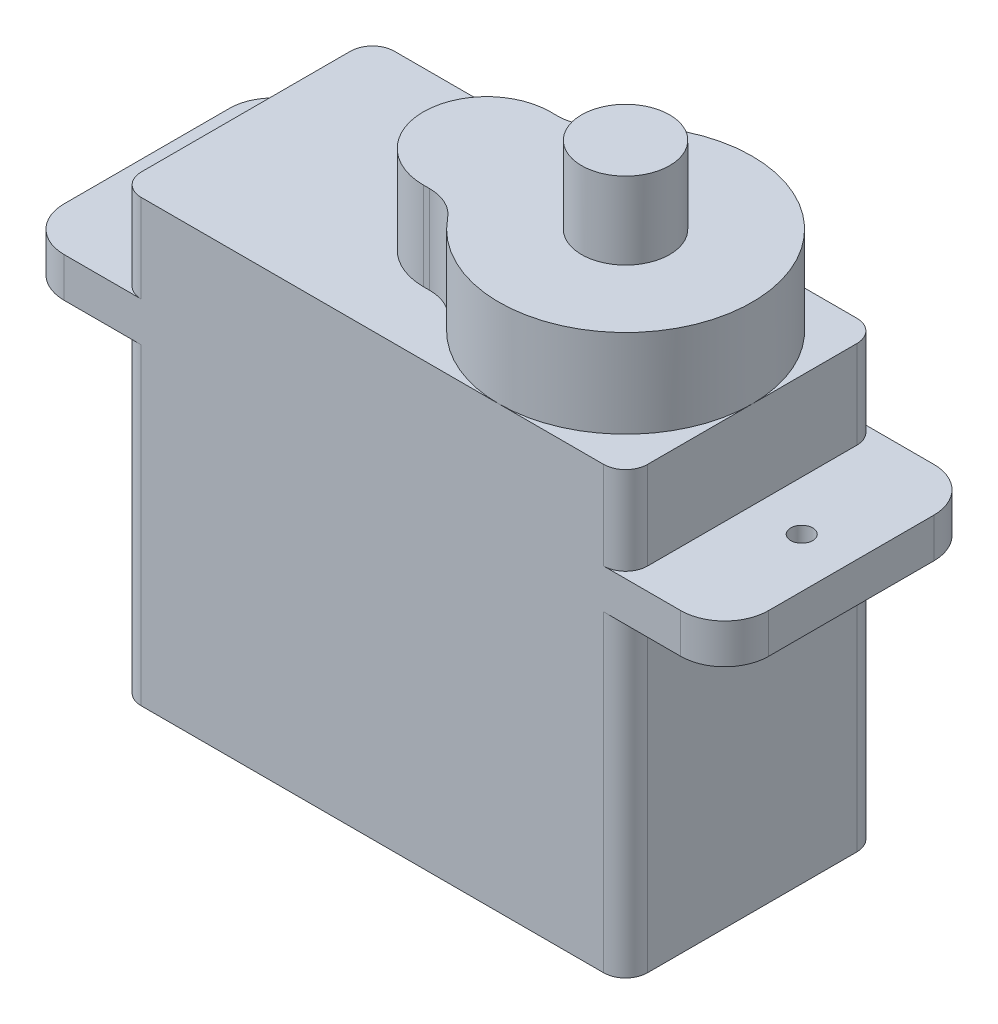
ISO-10303-21;
HEADER;
FILE_DESCRIPTION(('STEP AP214'),'2;1');
FILE_NAME('part.step','',(''),(''),'','','');
FILE_SCHEMA(('AUTOMOTIVE_DESIGN { 1 0 10303 214 1 1 1 1 }'));
ENDSEC;
DATA;
#1=APPLICATION_CONTEXT('core data for automotive mechanical design processes');
#2=APPLICATION_PROTOCOL_DEFINITION('international standard','automotive_design',2000,#1);
#3=PRODUCT_CONTEXT('',#1,'mechanical');
#4=PRODUCT('Part','Part','',(#3));
#5=PRODUCT_RELATED_PRODUCT_CATEGORY('part','',(#4));
#6=PRODUCT_DEFINITION_FORMATION('','',#4);
#7=PRODUCT_DEFINITION_CONTEXT('part definition',#1,'design');
#8=PRODUCT_DEFINITION('design','',#6,#7);
#9=PRODUCT_DEFINITION_SHAPE('','',#8);
#10=(LENGTH_UNIT() NAMED_UNIT(*) SI_UNIT(.MILLI.,.METRE.));
#11=(NAMED_UNIT(*) PLANE_ANGLE_UNIT() SI_UNIT($,.RADIAN.));
#12=(NAMED_UNIT(*) SI_UNIT($,.STERADIAN.) SOLID_ANGLE_UNIT());
#13=UNCERTAINTY_MEASURE_WITH_UNIT(LENGTH_MEASURE(1.E-05),#10,'distance_accuracy_value','');
#14=(GEOMETRIC_REPRESENTATION_CONTEXT(3) GLOBAL_UNCERTAINTY_ASSIGNED_CONTEXT((#13)) GLOBAL_UNIT_ASSIGNED_CONTEXT((#10,
#11,#12)) REPRESENTATION_CONTEXT('',''));
#15=CARTESIAN_POINT('',(0.,0.,0.));
#16=DIRECTION('',(0.,0.,1.));
#17=DIRECTION('',(1.,0.,0.));
#18=AXIS2_PLACEMENT_3D('',#15,#16,#17);
#19=CARTESIAN_POINT('',(-0.290992678358187,14.,10.6047819168344));
#20=DIRECTION('',(0.,-1.,0.));
#21=DIRECTION('',(0.,0.,-1.));
#22=AXIS2_PLACEMENT_3D('',#19,#20,#21);
#23=PLANE('',#22);
#24=CARTESIAN_POINT('',(-0.290992678358187,14.,10.6047819168344));
#25=DIRECTION('',(0.,-1.,0.));
#26=DIRECTION('',(0.,0.,-1.));
#27=AXIS2_PLACEMENT_3D('',#24,#25,#26);
#28=CIRCLE('',#27,2.);
#29=CARTESIAN_POINT('',(-0.290992678358187,14.,8.60478191683445));
#30=VERTEX_POINT('',#29);
#31=CARTESIAN_POINT('',(1.26797317412135,14.,9.35193497055459));
#32=VERTEX_POINT('',#31);
#33=EDGE_CURVE('E256',#30,#32,#28,.T.);
#34=ORIENTED_EDGE('',*,*,#33,.T.);
#35=CARTESIAN_POINT('',(5.75,14.,5.75));
#36=DIRECTION('',(0.,1.,0.));
#37=DIRECTION('',(0.,0.,1.));
#38=AXIS2_PLACEMENT_3D('',#35,#36,#37);
#39=CIRCLE('',#38,5.75);
#40=CARTESIAN_POINT('',(1.300370190019,14.,2.10811936574955));
#41=VERTEX_POINT('',#40);
#42=EDGE_CURVE('E242',#32,#41,#39,.T.);
#43=ORIENTED_EDGE('',*,*,#42,.T.);
#44=CARTESIAN_POINT('',(-0.247327135191779,14.,0.841378275575481));
#45=DIRECTION('',(0.,1.,0.));
#46=DIRECTION('',(0.,0.,1.));
#47=AXIS2_PLACEMENT_3D('',#44,#45,#46);
#48=CIRCLE('',#47,2.);
#49=CARTESIAN_POINT('',(-0.247327135191779,14.,2.84137827557548));
#50=VERTEX_POINT('',#49);
#51=EDGE_CURVE('E255',#50,#41,#48,.T.);
#52=ORIENTED_EDGE('',*,*,#51,.F.);
#53=DIRECTION('',(-1.,0.,0.));
#54=VECTOR('',#53,1.);
#55=CARTESIAN_POINT('',(-0.247327135191779,14.,2.84137827557548));
#56=LINE('',#55,#54);
#57=CARTESIAN_POINT('',(-0.577609194778006,14.,2.84137827557548));
#58=VERTEX_POINT('',#57);
#59=EDGE_CURVE('E527',#50,#58,#56,.T.);
#60=ORIENTED_EDGE('',*,*,#59,.T.);
#61=CARTESIAN_POINT('',(-0.577609194778006,14.,5.72308009620496));
#62=DIRECTION('',(0.,1.,0.));
#63=DIRECTION('',(0.,0.,1.));
#64=AXIS2_PLACEMENT_3D('',#61,#62,#63);
#65=CIRCLE('',#64,2.88170182062948);
#66=CARTESIAN_POINT('',(-0.577609194778006,14.,8.60478191683445));
#67=VERTEX_POINT('',#66);
#68=EDGE_CURVE('E525',#58,#67,#65,.T.);
#69=ORIENTED_EDGE('',*,*,#68,.T.);
#70=DIRECTION('',(-1.,0.,0.));
#71=VECTOR('',#70,1.);
#72=CARTESIAN_POINT('',(-0.290992678358187,14.,8.60478191683445));
#73=LINE('',#72,#71);
#74=EDGE_CURVE('E262',#30,#67,#73,.T.);
#75=ORIENTED_EDGE('',*,*,#74,.F.);
#76=EDGE_LOOP('',(#34,#43,#52,#60,#69,#75));
#77=FACE_BOUND('',#76,.T.);
#78=CARTESIAN_POINT('',(5.75,14.,5.75));
#79=DIRECTION('',(0.,-1.,0.));
#80=DIRECTION('',(0.,0.,-1.));
#81=AXIS2_PLACEMENT_3D('',#78,#79,#80);
#82=CIRCLE('',#81,2.);
#83=CARTESIAN_POINT('',(5.75,14.,3.75));
#84=VERTEX_POINT('',#83);
#85=EDGE_CURVE('E12',#84,#84,#82,.F.);
#86=ORIENTED_EDGE('',*,*,#85,.F.);
#87=EDGE_LOOP('',(#86));
#88=FACE_BOUND('',#87,.T.);
#89=ADVANCED_FACE('F34',(#77,#88),#23,.F.);
#90=CARTESIAN_POINT('',(16.,4.2,11.5));
#91=DIRECTION('',(0.,1.,0.));
#92=DIRECTION('',(0.,0.,1.));
#93=AXIS2_PLACEMENT_3D('',#90,#91,#92);
#94=PLANE('',#93);
#95=DIRECTION('',(0.,0.,-1.));
#96=VECTOR('',#95,1.);
#97=CARTESIAN_POINT('',(16.,4.2,11.5));
#98=LINE('',#97,#96);
#99=CARTESIAN_POINT('',(16.,4.2,9.5));
#100=VERTEX_POINT('',#99);
#101=CARTESIAN_POINT('',(16.,4.2,2.));
#102=VERTEX_POINT('',#101);
#103=EDGE_CURVE('E399',#100,#102,#98,.T.);
#104=ORIENTED_EDGE('',*,*,#103,.F.);
#105=CARTESIAN_POINT('',(14.,4.2,9.5));
#106=DIRECTION('',(0.,1.,0.));
#107=DIRECTION('',(0.,0.,1.));
#108=AXIS2_PLACEMENT_3D('',#105,#106,#107);
#109=CIRCLE('',#108,2.);
#110=CARTESIAN_POINT('',(14.,4.2,11.5));
#111=VERTEX_POINT('',#110);
#112=EDGE_CURVE('E446',#100,#111,#109,.F.);
#113=ORIENTED_EDGE('',*,*,#112,.T.);
#114=DIRECTION('',(-1.,0.,0.));
#115=VECTOR('',#114,1.);
#116=CARTESIAN_POINT('',(16.,4.2,11.5));
#117=LINE('',#116,#115);
#118=CARTESIAN_POINT('',(10.5,4.2,11.5));
#119=VERTEX_POINT('',#118);
#120=EDGE_CURVE('E414',#111,#119,#117,.T.);
#121=ORIENTED_EDGE('',*,*,#120,.T.);
#122=CARTESIAN_POINT('',(10.5,4.2,10.5));
#123=DIRECTION('',(0.,1.,0.));
#124=DIRECTION('',(0.,0.,1.));
#125=AXIS2_PLACEMENT_3D('',#122,#123,#124);
#126=CIRCLE('',#125,1.);
#127=CARTESIAN_POINT('',(11.5,4.2,10.5));
#128=VERTEX_POINT('',#127);
#129=EDGE_CURVE('E334',#119,#128,#126,.T.);
#130=ORIENTED_EDGE('',*,*,#129,.T.);
#131=DIRECTION('',(0.,0.,-1.));
#132=VECTOR('',#131,1.);
#133=CARTESIAN_POINT('',(11.5,4.2,11.5));
#134=LINE('',#133,#132);
#135=CARTESIAN_POINT('',(11.5,4.2,1.));
#136=VERTEX_POINT('',#135);
#137=EDGE_CURVE('E391',#128,#136,#134,.T.);
#138=ORIENTED_EDGE('',*,*,#137,.T.);
#139=CARTESIAN_POINT('',(10.5,4.2,1.));
#140=DIRECTION('',(0.,1.,0.));
#141=DIRECTION('',(0.,0.,1.));
#142=AXIS2_PLACEMENT_3D('',#139,#140,#141);
#143=CIRCLE('',#142,1.);
#144=CARTESIAN_POINT('',(10.5,4.2,0.));
#145=VERTEX_POINT('',#144);
#146=EDGE_CURVE('E331',#136,#145,#143,.T.);
#147=ORIENTED_EDGE('',*,*,#146,.T.);
#148=DIRECTION('',(-1.,0.,0.));
#149=VECTOR('',#148,1.);
#150=CARTESIAN_POINT('',(16.,4.2,0.));
#151=LINE('',#150,#149);
#152=CARTESIAN_POINT('',(14.,4.2,0.));
#153=VERTEX_POINT('',#152);
#154=EDGE_CURVE('E411',#153,#145,#151,.T.);
#155=ORIENTED_EDGE('',*,*,#154,.F.);
#156=CARTESIAN_POINT('',(14.,4.2,2.));
#157=DIRECTION('',(0.,1.,0.));
#158=DIRECTION('',(0.,0.,1.));
#159=AXIS2_PLACEMENT_3D('',#156,#157,#158);
#160=CIRCLE('',#159,2.);
#161=EDGE_CURVE('E415',#153,#102,#160,.F.);
#162=ORIENTED_EDGE('',*,*,#161,.T.);
#163=EDGE_LOOP('',(#104,#113,#121,#130,#138,#147,#155,#162));
#164=FACE_BOUND('',#163,.T.);
#165=CARTESIAN_POINT('',(13.75,4.2,5.75));
#166=DIRECTION('',(0.,1.,0.));
#167=DIRECTION('',(0.,0.,1.));
#168=AXIS2_PLACEMENT_3D('',#165,#166,#167);
#169=CIRCLE('',#168,0.500000000000001);
#170=CARTESIAN_POINT('',(13.75,4.2,6.25));
#171=VERTEX_POINT('',#170);
#172=EDGE_CURVE('E533',#171,#171,#169,.T.);
#173=ORIENTED_EDGE('',*,*,#172,.T.);
#174=EDGE_LOOP('',(#173));
#175=FACE_BOUND('',#174,.T.);
#176=ADVANCED_FACE('F550',(#164,#175),#94,.F.);
#177=CARTESIAN_POINT('',(16.,6.,11.5));
#178=DIRECTION('',(0.,1.,0.));
#179=DIRECTION('',(0.,0.,1.));
#180=AXIS2_PLACEMENT_3D('',#177,#178,#179);
#181=PLANE('',#180);
#182=DIRECTION('',(-1.,0.,0.));
#183=VECTOR('',#182,1.);
#184=CARTESIAN_POINT('',(16.,6.,11.5));
#185=LINE('',#184,#183);
#186=CARTESIAN_POINT('',(14.,6.,11.5));
#187=VERTEX_POINT('',#186);
#188=CARTESIAN_POINT('',(10.5,6.,11.5));
#189=VERTEX_POINT('',#188);
#190=EDGE_CURVE('E430',#187,#189,#185,.T.);
#191=ORIENTED_EDGE('',*,*,#190,.F.);
#192=CARTESIAN_POINT('',(14.,6.,9.5));
#193=DIRECTION('',(0.,1.,0.));
#194=DIRECTION('',(0.,0.,1.));
#195=AXIS2_PLACEMENT_3D('',#192,#193,#194);
#196=CIRCLE('',#195,2.);
#197=CARTESIAN_POINT('',(16.,6.,9.5));
#198=VERTEX_POINT('',#197);
#199=EDGE_CURVE('E704',#187,#198,#196,.T.);
#200=ORIENTED_EDGE('',*,*,#199,.T.);
#201=DIRECTION('',(0.,0.,-1.));
#202=VECTOR('',#201,1.);
#203=CARTESIAN_POINT('',(16.,6.,11.5));
#204=LINE('',#203,#202);
#205=CARTESIAN_POINT('',(16.,6.,2.));
#206=VERTEX_POINT('',#205);
#207=EDGE_CURVE('E408',#198,#206,#204,.T.);
#208=ORIENTED_EDGE('',*,*,#207,.T.);
#209=CARTESIAN_POINT('',(14.,6.,2.));
#210=DIRECTION('',(0.,1.,0.));
#211=DIRECTION('',(0.,0.,1.));
#212=AXIS2_PLACEMENT_3D('',#209,#210,#211);
#213=CIRCLE('',#212,2.);
#214=CARTESIAN_POINT('',(14.,6.,0.));
#215=VERTEX_POINT('',#214);
#216=EDGE_CURVE('E386',#206,#215,#213,.T.);
#217=ORIENTED_EDGE('',*,*,#216,.T.);
#218=DIRECTION('',(-1.,0.,0.));
#219=VECTOR('',#218,1.);
#220=CARTESIAN_POINT('',(16.,6.,0.));
#221=LINE('',#220,#219);
#222=CARTESIAN_POINT('',(10.5,6.,0.));
#223=VERTEX_POINT('',#222);
#224=EDGE_CURVE('E393',#215,#223,#221,.T.);
#225=ORIENTED_EDGE('',*,*,#224,.T.);
#226=CARTESIAN_POINT('',(10.5,6.,1.));
#227=DIRECTION('',(0.,1.,0.));
#228=DIRECTION('',(0.,0.,1.));
#229=AXIS2_PLACEMENT_3D('',#226,#227,#228);
#230=CIRCLE('',#229,1.);
#231=CARTESIAN_POINT('',(11.5,6.,1.));
#232=VERTEX_POINT('',#231);
#233=EDGE_CURVE('E336',#223,#232,#230,.F.);
#234=ORIENTED_EDGE('',*,*,#233,.T.);
#235=DIRECTION('',(0.,0.,-1.));
#236=VECTOR('',#235,1.);
#237=CARTESIAN_POINT('',(11.5,6.,11.5));
#238=LINE('',#237,#236);
#239=CARTESIAN_POINT('',(11.5,6.,10.5));
#240=VERTEX_POINT('',#239);
#241=EDGE_CURVE('E387',#240,#232,#238,.T.);
#242=ORIENTED_EDGE('',*,*,#241,.F.);
#243=CARTESIAN_POINT('',(10.5,6.,10.5));
#244=DIRECTION('',(0.,1.,0.));
#245=DIRECTION('',(0.,0.,1.));
#246=AXIS2_PLACEMENT_3D('',#243,#244,#245);
#247=CIRCLE('',#246,1.);
#248=EDGE_CURVE('E338',#240,#189,#247,.F.);
#249=ORIENTED_EDGE('',*,*,#248,.T.);
#250=EDGE_LOOP('',(#191,#200,#208,#217,#225,#234,#242,#249));
#251=FACE_BOUND('',#250,.T.);
#252=CARTESIAN_POINT('',(13.75,6.,5.75));
#253=DIRECTION('',(0.,-1.,0.));
#254=DIRECTION('',(0.,0.,1.));
#255=AXIS2_PLACEMENT_3D('',#252,#253,#254);
#256=CIRCLE('',#255,0.500000000000001);
#257=CARTESIAN_POINT('',(13.75,6.,6.25));
#258=VERTEX_POINT('',#257);
#259=EDGE_CURVE('E531',#258,#258,#256,.T.);
#260=ORIENTED_EDGE('',*,*,#259,.T.);
#261=EDGE_LOOP('',(#260));
#262=FACE_BOUND('',#261,.T.);
#263=ADVANCED_FACE('F555',(#251,#262),#181,.T.);
#264=CARTESIAN_POINT('',(-11.5,10.,11.5));
#265=DIRECTION('',(0.,-1.,0.));
#266=DIRECTION('',(0.,0.,-1.));
#267=AXIS2_PLACEMENT_3D('',#264,#265,#266);
#268=PLANE('',#267);
#269=DIRECTION('',(0.,0.,-1.));
#270=VECTOR('',#269,1.);
#271=CARTESIAN_POINT('',(-11.5,10.,11.5));
#272=LINE('',#271,#270);
#273=CARTESIAN_POINT('',(-11.5,10.,10.5));
#274=VERTEX_POINT('',#273);
#275=CARTESIAN_POINT('',(-11.5,10.,1.));
#276=VERTEX_POINT('',#275);
#277=EDGE_CURVE('E505',#274,#276,#272,.T.);
#278=ORIENTED_EDGE('',*,*,#277,.F.);
#279=CARTESIAN_POINT('',(-10.5,10.,10.5));
#280=DIRECTION('',(0.,-1.,0.));
#281=DIRECTION('',(0.,0.,-1.));
#282=AXIS2_PLACEMENT_3D('',#279,#280,#281);
#283=CIRCLE('',#282,1.);
#284=CARTESIAN_POINT('',(-10.5,10.,11.5));
#285=VERTEX_POINT('',#284);
#286=EDGE_CURVE('E324',#274,#285,#283,.F.);
#287=ORIENTED_EDGE('',*,*,#286,.T.);
#288=DIRECTION('',(-1.,0.,0.));
#289=VECTOR('',#288,1.);
#290=CARTESIAN_POINT('',(-11.5,10.,11.5));
#291=LINE('',#290,#289);
#292=CARTESIAN_POINT('',(5.75,10.,11.5));
#293=VERTEX_POINT('',#292);
#294=EDGE_CURVE('E499',#293,#285,#291,.T.);
#295=ORIENTED_EDGE('',*,*,#294,.F.);
#296=CARTESIAN_POINT('',(5.75,10.,5.75));
#297=DIRECTION('',(0.,1.,0.));
#298=DIRECTION('',(0.,0.,1.));
#299=AXIS2_PLACEMENT_3D('',#296,#297,#298);
#300=CIRCLE('',#299,5.75);
#301=CARTESIAN_POINT('',(1.26797317412135,10.,9.35193497055459));
#302=VERTEX_POINT('',#301);
#303=EDGE_CURVE('E371',#302,#293,#300,.T.);
#304=ORIENTED_EDGE('',*,*,#303,.F.);
#305=CARTESIAN_POINT('',(-0.290992678358187,10.,10.6047819168344));
#306=DIRECTION('',(0.,-1.,0.));
#307=DIRECTION('',(0.,0.,-1.));
#308=AXIS2_PLACEMENT_3D('',#305,#306,#307);
#309=CIRCLE('',#308,2.);
#310=CARTESIAN_POINT('',(-0.290992678358187,10.,8.60478191683445));
#311=VERTEX_POINT('',#310);
#312=EDGE_CURVE('E268',#311,#302,#309,.T.);
#313=ORIENTED_EDGE('',*,*,#312,.F.);
#314=DIRECTION('',(-1.,0.,0.));
#315=VECTOR('',#314,1.);
#316=CARTESIAN_POINT('',(-0.290992678358187,10.,8.60478191683445));
#317=LINE('',#316,#315);
#318=CARTESIAN_POINT('',(-0.577609194778006,10.,8.60478191683445));
#319=VERTEX_POINT('',#318);
#320=EDGE_CURVE('E265',#311,#319,#317,.T.);
#321=ORIENTED_EDGE('',*,*,#320,.T.);
#322=CARTESIAN_POINT('',(-0.577609194778006,10.,5.72308009620496));
#323=DIRECTION('',(0.,1.,0.));
#324=DIRECTION('',(0.,0.,1.));
#325=AXIS2_PLACEMENT_3D('',#322,#323,#324);
#326=CIRCLE('',#325,2.88170182062948);
#327=CARTESIAN_POINT('',(-0.577609194778006,10.,2.84137827557548));
#328=VERTEX_POINT('',#327);
#329=EDGE_CURVE('E975',#328,#319,#326,.T.);
#330=ORIENTED_EDGE('',*,*,#329,.F.);
#331=DIRECTION('',(-1.,0.,0.));
#332=VECTOR('',#331,1.);
#333=CARTESIAN_POINT('',(-0.247327135191779,10.,2.84137827557548));
#334=LINE('',#333,#332);
#335=CARTESIAN_POINT('',(-0.247327135191779,10.,2.84137827557548));
#336=VERTEX_POINT('',#335);
#337=EDGE_CURVE('E517',#336,#328,#334,.T.);
#338=ORIENTED_EDGE('',*,*,#337,.F.);
#339=CARTESIAN_POINT('',(-0.247327135191779,10.,0.841378275575481));
#340=DIRECTION('',(0.,1.,0.));
#341=DIRECTION('',(0.,0.,1.));
#342=AXIS2_PLACEMENT_3D('',#339,#340,#341);
#343=CIRCLE('',#342,2.);
#344=CARTESIAN_POINT('',(1.300370190019,10.,2.10811936574955));
#345=VERTEX_POINT('',#344);
#346=EDGE_CURVE('E516',#336,#345,#343,.T.);
#347=ORIENTED_EDGE('',*,*,#346,.T.);
#348=CARTESIAN_POINT('',(5.75,10.,0.));
#349=VERTEX_POINT('',#348);
#350=EDGE_CURVE('E491',#349,#345,#300,.T.);
#351=ORIENTED_EDGE('',*,*,#350,.F.);
#352=DIRECTION('',(-1.,0.,0.));
#353=VECTOR('',#352,1.);
#354=CARTESIAN_POINT('',(-11.5,10.,0.));
#355=LINE('',#354,#353);
#356=CARTESIAN_POINT('',(-10.5,10.,0.));
#357=VERTEX_POINT('',#356);
#358=EDGE_CURVE('E428',#349,#357,#355,.T.);
#359=ORIENTED_EDGE('',*,*,#358,.T.);
#360=CARTESIAN_POINT('',(-10.5,10.,1.));
#361=DIRECTION('',(0.,-1.,0.));
#362=DIRECTION('',(0.,0.,-1.));
#363=AXIS2_PLACEMENT_3D('',#360,#361,#362);
#364=CIRCLE('',#363,1.);
#365=EDGE_CURVE('E49',#357,#276,#364,.F.);
#366=ORIENTED_EDGE('',*,*,#365,.T.);
#367=EDGE_LOOP('',(#278,#287,#295,#304,#313,#321,#330,#338,#347,#351,#359,#366));
#368=FACE_BOUND('',#367,.T.);
#369=ADVANCED_FACE('F490',(#368),#268,.F.);
#370=CARTESIAN_POINT('',(10.5,10.,11.5));
#371=VERTEX_POINT('',#370);
#372=EDGE_CURVE('E402',#371,#293,#291,.T.);
#373=ORIENTED_EDGE('',*,*,#372,.F.);
#374=CARTESIAN_POINT('',(10.5,10.,10.5));
#375=DIRECTION('',(0.,-1.,0.));
#376=DIRECTION('',(0.,0.,-1.));
#377=AXIS2_PLACEMENT_3D('',#374,#375,#376);
#378=CIRCLE('',#377,1.);
#379=CARTESIAN_POINT('',(11.5,10.,10.5));
#380=VERTEX_POINT('',#379);
#381=EDGE_CURVE('E317',#371,#380,#378,.F.);
#382=ORIENTED_EDGE('',*,*,#381,.T.);
#383=DIRECTION('',(0.,0.,-1.));
#384=VECTOR('',#383,1.);
#385=CARTESIAN_POINT('',(11.5,10.,11.5));
#386=LINE('',#385,#384);
#387=CARTESIAN_POINT('',(11.5,10.,5.75));
#388=VERTEX_POINT('',#387);
#389=EDGE_CURVE('E420',#380,#388,#386,.T.);
#390=ORIENTED_EDGE('',*,*,#389,.T.);
#391=EDGE_CURVE('E363',#293,#388,#300,.T.);
#392=ORIENTED_EDGE('',*,*,#391,.F.);
#393=EDGE_LOOP('',(#373,#382,#390,#392));
#394=FACE_BOUND('',#393,.T.);
#395=ADVANCED_FACE('F614',(#394),#268,.F.);
#396=CARTESIAN_POINT('',(11.5,10.,1.));
#397=VERTEX_POINT('',#396);
#398=EDGE_CURVE('E506',#388,#397,#386,.T.);
#399=ORIENTED_EDGE('',*,*,#398,.T.);
#400=CARTESIAN_POINT('',(10.5,10.,1.));
#401=DIRECTION('',(0.,-1.,0.));
#402=DIRECTION('',(0.,0.,-1.));
#403=AXIS2_PLACEMENT_3D('',#400,#401,#402);
#404=CIRCLE('',#403,1.);
#405=CARTESIAN_POINT('',(10.5,10.,0.));
#406=VERTEX_POINT('',#405);
#407=EDGE_CURVE('E315',#397,#406,#404,.F.);
#408=ORIENTED_EDGE('',*,*,#407,.T.);
#409=EDGE_CURVE('E492',#406,#349,#355,.T.);
#410=ORIENTED_EDGE('',*,*,#409,.T.);
#411=EDGE_CURVE('E369',#388,#349,#300,.T.);
#412=ORIENTED_EDGE('',*,*,#411,.F.);
#413=EDGE_LOOP('',(#399,#408,#410,#412));
#414=FACE_BOUND('',#413,.T.);
#415=ADVANCED_FACE('F615',(#414),#268,.F.);
#416=CARTESIAN_POINT('',(-11.5,-10.,11.5));
#417=DIRECTION('',(1.,0.,0.));
#418=DIRECTION('',(0.,0.,-1.));
#419=AXIS2_PLACEMENT_3D('',#416,#417,#418);
#420=PLANE('',#419);
#421=DIRECTION('',(0.,0.,-1.));
#422=VECTOR('',#421,1.);
#423=CARTESIAN_POINT('',(-11.5,6.,11.5));
#424=LINE('',#423,#422);
#425=CARTESIAN_POINT('',(-11.5,6.,10.5));
#426=VERTEX_POINT('',#425);
#427=CARTESIAN_POINT('',(-11.5,6.,1.));
#428=VERTEX_POINT('',#427);
#429=EDGE_CURVE('E272',#426,#428,#424,.T.);
#430=ORIENTED_EDGE('',*,*,#429,.F.);
#431=DIRECTION('',(0.,-1.,0.));
#432=VECTOR('',#431,1.);
#433=CARTESIAN_POINT('',(-11.5,-10.,10.5));
#434=LINE('',#433,#432);
#435=EDGE_CURVE('E56',#426,#274,#434,.F.);
#436=ORIENTED_EDGE('',*,*,#435,.T.);
#437=ORIENTED_EDGE('',*,*,#277,.T.);
#438=DIRECTION('',(0.,-1.,0.));
#439=VECTOR('',#438,1.);
#440=CARTESIAN_POINT('',(-11.5,6.,1.));
#441=LINE('',#440,#439);
#442=EDGE_CURVE('E319',#276,#428,#441,.T.);
#443=ORIENTED_EDGE('',*,*,#442,.T.);
#444=EDGE_LOOP('',(#430,#436,#437,#443));
#445=FACE_BOUND('',#444,.T.);
#446=ADVANCED_FACE('F611',(#445),#420,.F.);
#447=CARTESIAN_POINT('',(11.5,-10.,11.5));
#448=DIRECTION('',(-1.,0.,0.));
#449=DIRECTION('',(0.,0.,1.));
#450=AXIS2_PLACEMENT_3D('',#447,#448,#449);
#451=PLANE('',#450);
#452=DIRECTION('',(0.,0.,-1.));
#453=VECTOR('',#452,1.);
#454=CARTESIAN_POINT('',(11.5,-10.,11.5));
#455=LINE('',#454,#453);
#456=CARTESIAN_POINT('',(11.5,-10.,10.5));
#457=VERTEX_POINT('',#456);
#458=CARTESIAN_POINT('',(11.5,-10.,1.));
#459=VERTEX_POINT('',#458);
#460=EDGE_CURVE('E500',#457,#459,#455,.T.);
#461=ORIENTED_EDGE('',*,*,#460,.T.);
#462=DIRECTION('',(0.,1.,0.));
#463=VECTOR('',#462,1.);
#464=CARTESIAN_POINT('',(11.5,4.2,1.));
#465=LINE('',#464,#463);
#466=EDGE_CURVE('E299',#459,#136,#465,.T.);
#467=ORIENTED_EDGE('',*,*,#466,.T.);
#468=ORIENTED_EDGE('',*,*,#137,.F.);
#469=DIRECTION('',(0.,1.,0.));
#470=VECTOR('',#469,1.);
#471=CARTESIAN_POINT('',(11.5,-10.,10.5));
#472=LINE('',#471,#470);
#473=EDGE_CURVE('E297',#128,#457,#472,.F.);
#474=ORIENTED_EDGE('',*,*,#473,.T.);
#475=EDGE_LOOP('',(#461,#467,#468,#474));
#476=FACE_BOUND('',#475,.T.);
#477=ADVANCED_FACE('F618',(#476),#451,.F.);
#478=ORIENTED_EDGE('',*,*,#241,.T.);
#479=DIRECTION('',(0.,1.,0.));
#480=VECTOR('',#479,1.);
#481=CARTESIAN_POINT('',(11.5,10.,1.));
#482=LINE('',#481,#480);
#483=EDGE_CURVE('E312',#232,#397,#482,.T.);
#484=ORIENTED_EDGE('',*,*,#483,.T.);
#485=ORIENTED_EDGE('',*,*,#398,.F.);
#486=ORIENTED_EDGE('',*,*,#389,.F.);
#487=DIRECTION('',(0.,1.,0.));
#488=VECTOR('',#487,1.);
#489=CARTESIAN_POINT('',(11.5,-10.,10.5));
#490=LINE('',#489,#488);
#491=EDGE_CURVE('E310',#380,#240,#490,.F.);
#492=ORIENTED_EDGE('',*,*,#491,.T.);
#493=EDGE_LOOP('',(#478,#484,#485,#486,#492));
#494=FACE_BOUND('',#493,.T.);
#495=ADVANCED_FACE('F609',(#494),#451,.F.);
#496=DIRECTION('',(0.,0.,-1.));
#497=VECTOR('',#496,1.);
#498=CARTESIAN_POINT('',(-11.5,4.2,11.5));
#499=LINE('',#498,#497);
#500=CARTESIAN_POINT('',(-11.5,4.2,10.5));
#501=VERTEX_POINT('',#500);
#502=CARTESIAN_POINT('',(-11.5,4.2,1.));
#503=VERTEX_POINT('',#502);
#504=EDGE_CURVE('E269',#501,#503,#499,.T.);
#505=ORIENTED_EDGE('',*,*,#504,.T.);
#506=DIRECTION('',(0.,-1.,0.));
#507=VECTOR('',#506,1.);
#508=CARTESIAN_POINT('',(-11.5,-10.,1.));
#509=LINE('',#508,#507);
#510=CARTESIAN_POINT('',(-11.5,-10.,1.));
#511=VERTEX_POINT('',#510);
#512=EDGE_CURVE('E328',#503,#511,#509,.T.);
#513=ORIENTED_EDGE('',*,*,#512,.T.);
#514=DIRECTION('',(0.,0.,-1.));
#515=VECTOR('',#514,1.);
#516=CARTESIAN_POINT('',(-11.5,-10.,11.5));
#517=LINE('',#516,#515);
#518=CARTESIAN_POINT('',(-11.5,-10.,10.5));
#519=VERTEX_POINT('',#518);
#520=EDGE_CURVE('E503',#519,#511,#517,.T.);
#521=ORIENTED_EDGE('',*,*,#520,.F.);
#522=DIRECTION('',(0.,-1.,0.));
#523=VECTOR('',#522,1.);
#524=CARTESIAN_POINT('',(-11.5,-10.,10.5));
#525=LINE('',#524,#523);
#526=EDGE_CURVE('E326',#519,#501,#525,.F.);
#527=ORIENTED_EDGE('',*,*,#526,.T.);
#528=EDGE_LOOP('',(#505,#513,#521,#527));
#529=FACE_BOUND('',#528,.T.);
#530=ADVANCED_FACE('F605',(#529),#420,.F.);
#531=CARTESIAN_POINT('',(-11.5,-10.,11.5));
#532=DIRECTION('',(0.,1.,0.));
#533=DIRECTION('',(0.,0.,1.));
#534=AXIS2_PLACEMENT_3D('',#531,#532,#533);
#535=PLANE('',#534);
#536=DIRECTION('',(1.,0.,0.));
#537=VECTOR('',#536,1.);
#538=CARTESIAN_POINT('',(-11.5,-10.,0.));
#539=LINE('',#538,#537);
#540=CARTESIAN_POINT('',(-10.5,-10.,0.));
#541=VERTEX_POINT('',#540);
#542=CARTESIAN_POINT('',(10.5,-10.,0.));
#543=VERTEX_POINT('',#542);
#544=EDGE_CURVE('E494',#541,#543,#539,.T.);
#545=ORIENTED_EDGE('',*,*,#544,.T.);
#546=CARTESIAN_POINT('',(10.5,-10.,1.));
#547=DIRECTION('',(0.,1.,0.));
#548=DIRECTION('',(0.,0.,1.));
#549=AXIS2_PLACEMENT_3D('',#546,#547,#548);
#550=CIRCLE('',#549,1.);
#551=EDGE_CURVE('E308',#543,#459,#550,.F.);
#552=ORIENTED_EDGE('',*,*,#551,.T.);
#553=ORIENTED_EDGE('',*,*,#460,.F.);
#554=CARTESIAN_POINT('',(10.5,-10.,10.5));
#555=DIRECTION('',(0.,1.,0.));
#556=DIRECTION('',(0.,0.,1.));
#557=AXIS2_PLACEMENT_3D('',#554,#555,#556);
#558=CIRCLE('',#557,1.);
#559=CARTESIAN_POINT('',(10.5,-10.,11.5));
#560=VERTEX_POINT('',#559);
#561=EDGE_CURVE('E306',#457,#560,#558,.F.);
#562=ORIENTED_EDGE('',*,*,#561,.T.);
#563=DIRECTION('',(1.,0.,0.));
#564=VECTOR('',#563,1.);
#565=CARTESIAN_POINT('',(-11.5,-10.,11.5));
#566=LINE('',#565,#564);
#567=CARTESIAN_POINT('',(-10.5,-10.,11.5));
#568=VERTEX_POINT('',#567);
#569=EDGE_CURVE('E496',#568,#560,#566,.T.);
#570=ORIENTED_EDGE('',*,*,#569,.F.);
#571=CARTESIAN_POINT('',(-10.5,-10.,10.5));
#572=DIRECTION('',(0.,1.,0.));
#573=DIRECTION('',(0.,0.,1.));
#574=AXIS2_PLACEMENT_3D('',#571,#572,#573);
#575=CIRCLE('',#574,1.);
#576=EDGE_CURVE('E302',#568,#519,#575,.F.);
#577=ORIENTED_EDGE('',*,*,#576,.T.);
#578=ORIENTED_EDGE('',*,*,#520,.T.);
#579=CARTESIAN_POINT('',(-10.5,-10.,1.));
#580=DIRECTION('',(0.,1.,0.));
#581=DIRECTION('',(0.,0.,1.));
#582=AXIS2_PLACEMENT_3D('',#579,#580,#581);
#583=CIRCLE('',#582,1.);
#584=EDGE_CURVE('E304',#511,#541,#583,.F.);
#585=ORIENTED_EDGE('',*,*,#584,.T.);
#586=EDGE_LOOP('',(#545,#552,#553,#562,#570,#577,#578,#585));
#587=FACE_BOUND('',#586,.T.);
#588=ADVANCED_FACE('F600',(#587),#535,.F.);
#589=CARTESIAN_POINT('',(0.,0.,11.5));
#590=DIRECTION('',(0.,0.,-1.));
#591=DIRECTION('',(-1.,0.,0.));
#592=AXIS2_PLACEMENT_3D('',#589,#590,#591);
#593=PLANE('',#592);
#594=ORIENTED_EDGE('',*,*,#120,.F.);
#595=DIRECTION('',(0.,1.,0.));
#596=VECTOR('',#595,1.);
#597=CARTESIAN_POINT('',(14.,0.,11.5));
#598=LINE('',#597,#596);
#599=EDGE_CURVE('E383',#111,#187,#598,.T.);
#600=ORIENTED_EDGE('',*,*,#599,.T.);
#601=ORIENTED_EDGE('',*,*,#190,.T.);
#602=DIRECTION('',(0.,1.,0.));
#603=VECTOR('',#602,1.);
#604=CARTESIAN_POINT('',(10.5,0.,11.5));
#605=LINE('',#604,#603);
#606=EDGE_CURVE('E366',#189,#371,#605,.T.);
#607=ORIENTED_EDGE('',*,*,#606,.T.);
#608=ORIENTED_EDGE('',*,*,#372,.T.);
#609=ORIENTED_EDGE('',*,*,#294,.T.);
#610=DIRECTION('',(0.,-1.,0.));
#611=VECTOR('',#610,1.);
#612=CARTESIAN_POINT('',(-10.5,0.,11.5));
#613=LINE('',#612,#611);
#614=CARTESIAN_POINT('',(-10.5,6.,11.5));
#615=VERTEX_POINT('',#614);
#616=EDGE_CURVE('E362',#285,#615,#613,.T.);
#617=ORIENTED_EDGE('',*,*,#616,.T.);
#618=DIRECTION('',(1.,0.,0.));
#619=VECTOR('',#618,1.);
#620=CARTESIAN_POINT('',(-16.,6.,11.5));
#621=LINE('',#620,#619);
#622=CARTESIAN_POINT('',(-14.,6.,11.5));
#623=VERTEX_POINT('',#622);
#624=EDGE_CURVE('E392',#623,#615,#621,.T.);
#625=ORIENTED_EDGE('',*,*,#624,.F.);
#626=DIRECTION('',(0.,1.,0.));
#627=VECTOR('',#626,1.);
#628=CARTESIAN_POINT('',(-14.,0.,11.5));
#629=LINE('',#628,#627);
#630=CARTESIAN_POINT('',(-14.,4.2,11.5));
#631=VERTEX_POINT('',#630);
#632=EDGE_CURVE('E381',#623,#631,#629,.F.);
#633=ORIENTED_EDGE('',*,*,#632,.T.);
#634=DIRECTION('',(1.,0.,0.));
#635=VECTOR('',#634,1.);
#636=CARTESIAN_POINT('',(-16.,4.2,11.5));
#637=LINE('',#636,#635);
#638=CARTESIAN_POINT('',(-10.5,4.2,11.5));
#639=VERTEX_POINT('',#638);
#640=EDGE_CURVE('E284',#631,#639,#637,.T.);
#641=ORIENTED_EDGE('',*,*,#640,.T.);
#642=DIRECTION('',(0.,-1.,0.));
#643=VECTOR('',#642,1.);
#644=CARTESIAN_POINT('',(-10.5,0.,11.5));
#645=LINE('',#644,#643);
#646=EDGE_CURVE('E358',#639,#568,#645,.T.);
#647=ORIENTED_EDGE('',*,*,#646,.T.);
#648=ORIENTED_EDGE('',*,*,#569,.T.);
#649=DIRECTION('',(0.,1.,0.));
#650=VECTOR('',#649,1.);
#651=CARTESIAN_POINT('',(10.5,0.,11.5));
#652=LINE('',#651,#650);
#653=EDGE_CURVE('E378',#560,#119,#652,.T.);
#654=ORIENTED_EDGE('',*,*,#653,.T.);
#655=EDGE_LOOP('',(#594,#600,#601,#607,#608,#609,#617,#625,#633,#641,#647,#648,#654));
#656=FACE_BOUND('',#655,.T.);
#657=ADVANCED_FACE('F597',(#656),#593,.F.);
#658=CARTESIAN_POINT('',(0.,0.,0.));
#659=DIRECTION('',(0.,0.,-1.));
#660=DIRECTION('',(-1.,0.,0.));
#661=AXIS2_PLACEMENT_3D('',#658,#659,#660);
#662=PLANE('',#661);
#663=ORIENTED_EDGE('',*,*,#224,.F.);
#664=DIRECTION('',(0.,1.,0.));
#665=VECTOR('',#664,1.);
#666=CARTESIAN_POINT('',(14.,4.2,0.));
#667=LINE('',#666,#665);
#668=EDGE_CURVE('E456',#215,#153,#667,.F.);
#669=ORIENTED_EDGE('',*,*,#668,.T.);
#670=ORIENTED_EDGE('',*,*,#154,.T.);
#671=DIRECTION('',(0.,1.,0.));
#672=VECTOR('',#671,1.);
#673=CARTESIAN_POINT('',(10.5,-10.,0.));
#674=LINE('',#673,#672);
#675=EDGE_CURVE('E451',#145,#543,#674,.F.);
#676=ORIENTED_EDGE('',*,*,#675,.T.);
#677=ORIENTED_EDGE('',*,*,#544,.F.);
#678=DIRECTION('',(0.,-1.,0.));
#679=VECTOR('',#678,1.);
#680=CARTESIAN_POINT('',(-10.5,4.2,0.));
#681=LINE('',#680,#679);
#682=CARTESIAN_POINT('',(-10.5,4.2,0.));
#683=VERTEX_POINT('',#682);
#684=EDGE_CURVE('E442',#541,#683,#681,.F.);
#685=ORIENTED_EDGE('',*,*,#684,.T.);
#686=DIRECTION('',(1.,0.,0.));
#687=VECTOR('',#686,1.);
#688=CARTESIAN_POINT('',(-16.,4.2,0.));
#689=LINE('',#688,#687);
#690=CARTESIAN_POINT('',(-14.,4.2,0.));
#691=VERTEX_POINT('',#690);
#692=EDGE_CURVE('E441',#691,#683,#689,.T.);
#693=ORIENTED_EDGE('',*,*,#692,.F.);
#694=DIRECTION('',(0.,1.,0.));
#695=VECTOR('',#694,1.);
#696=CARTESIAN_POINT('',(-14.,6.,0.));
#697=LINE('',#696,#695);
#698=CARTESIAN_POINT('',(-14.,6.,0.));
#699=VERTEX_POINT('',#698);
#700=EDGE_CURVE('E453',#691,#699,#697,.T.);
#701=ORIENTED_EDGE('',*,*,#700,.T.);
#702=DIRECTION('',(1.,0.,0.));
#703=VECTOR('',#702,1.);
#704=CARTESIAN_POINT('',(-16.,6.,0.));
#705=LINE('',#704,#703);
#706=CARTESIAN_POINT('',(-10.5,6.,0.));
#707=VERTEX_POINT('',#706);
#708=EDGE_CURVE('E432',#699,#707,#705,.T.);
#709=ORIENTED_EDGE('',*,*,#708,.T.);
#710=DIRECTION('',(0.,-1.,0.));
#711=VECTOR('',#710,1.);
#712=CARTESIAN_POINT('',(-10.5,10.,0.));
#713=LINE('',#712,#711);
#714=EDGE_CURVE('E445',#707,#357,#713,.F.);
#715=ORIENTED_EDGE('',*,*,#714,.T.);
#716=ORIENTED_EDGE('',*,*,#358,.F.);
#717=ORIENTED_EDGE('',*,*,#409,.F.);
#718=DIRECTION('',(0.,1.,0.));
#719=VECTOR('',#718,1.);
#720=CARTESIAN_POINT('',(10.5,6.,0.));
#721=LINE('',#720,#719);
#722=EDGE_CURVE('E448',#406,#223,#721,.F.);
#723=ORIENTED_EDGE('',*,*,#722,.T.);
#724=EDGE_LOOP('',(#663,#669,#670,#676,#677,#685,#693,#701,#709,#715,#716,#717,#723));
#725=FACE_BOUND('',#724,.T.);
#726=ADVANCED_FACE('F479',(#725),#662,.T.);
#727=CARTESIAN_POINT('',(16.,0.,0.));
#728=DIRECTION('',(-1.,0.,0.));
#729=DIRECTION('',(0.,0.,1.));
#730=AXIS2_PLACEMENT_3D('',#727,#728,#729);
#731=PLANE('',#730);
#732=ORIENTED_EDGE('',*,*,#207,.F.);
#733=DIRECTION('',(0.,1.,0.));
#734=VECTOR('',#733,1.);
#735=CARTESIAN_POINT('',(16.,0.,9.5));
#736=LINE('',#735,#734);
#737=EDGE_CURVE('E409',#198,#100,#736,.F.);
#738=ORIENTED_EDGE('',*,*,#737,.T.);
#739=ORIENTED_EDGE('',*,*,#103,.T.);
#740=DIRECTION('',(0.,1.,0.));
#741=VECTOR('',#740,1.);
#742=CARTESIAN_POINT('',(16.,6.,2.));
#743=LINE('',#742,#741);
#744=EDGE_CURVE('E699',#102,#206,#743,.T.);
#745=ORIENTED_EDGE('',*,*,#744,.T.);
#746=EDGE_LOOP('',(#732,#738,#739,#745));
#747=FACE_BOUND('',#746,.T.);
#748=ADVANCED_FACE('F586',(#747),#731,.F.);
#749=CARTESIAN_POINT('',(-16.,6.,11.5));
#750=DIRECTION('',(0.,-1.,0.));
#751=DIRECTION('',(0.,0.,-1.));
#752=AXIS2_PLACEMENT_3D('',#749,#750,#751);
#753=PLANE('',#752);
#754=CARTESIAN_POINT('',(-13.75,6.,5.75));
#755=DIRECTION('',(0.,1.,0.));
#756=DIRECTION('',(0.,0.,1.));
#757=AXIS2_PLACEMENT_3D('',#754,#755,#756);
#758=CIRCLE('',#757,0.500000000000001);
#759=CARTESIAN_POINT('',(-13.75,6.,6.25));
#760=VERTEX_POINT('',#759);
#761=EDGE_CURVE('E518',#760,#760,#758,.T.);
#762=ORIENTED_EDGE('',*,*,#761,.F.);
#763=EDGE_LOOP('',(#762));
#764=FACE_BOUND('',#763,.T.);
#765=ORIENTED_EDGE('',*,*,#708,.F.);
#766=CARTESIAN_POINT('',(-14.,6.,2.));
#767=DIRECTION('',(0.,-1.,0.));
#768=DIRECTION('',(0.,0.,-1.));
#769=AXIS2_PLACEMENT_3D('',#766,#767,#768);
#770=CIRCLE('',#769,2.);
#771=CARTESIAN_POINT('',(-16.,6.,2.));
#772=VERTEX_POINT('',#771);
#773=EDGE_CURVE('E462',#699,#772,#770,.F.);
#774=ORIENTED_EDGE('',*,*,#773,.T.);
#775=DIRECTION('',(0.,0.,-1.));
#776=VECTOR('',#775,1.);
#777=CARTESIAN_POINT('',(-16.,6.,11.5));
#778=LINE('',#777,#776);
#779=CARTESIAN_POINT('',(-16.,6.,9.5));
#780=VERTEX_POINT('',#779);
#781=EDGE_CURVE('E281',#780,#772,#778,.T.);
#782=ORIENTED_EDGE('',*,*,#781,.F.);
#783=CARTESIAN_POINT('',(-14.,6.,9.5));
#784=DIRECTION('',(0.,-1.,0.));
#785=DIRECTION('',(0.,0.,-1.));
#786=AXIS2_PLACEMENT_3D('',#783,#784,#785);
#787=CIRCLE('',#786,2.);
#788=EDGE_CURVE('E458',#780,#623,#787,.F.);
#789=ORIENTED_EDGE('',*,*,#788,.T.);
#790=ORIENTED_EDGE('',*,*,#624,.T.);
#791=CARTESIAN_POINT('',(-10.5,6.,10.5));
#792=DIRECTION('',(0.,-1.,0.));
#793=DIRECTION('',(0.,0.,-1.));
#794=AXIS2_PLACEMENT_3D('',#791,#792,#793);
#795=CIRCLE('',#794,1.);
#796=EDGE_CURVE('E341',#615,#426,#795,.T.);
#797=ORIENTED_EDGE('',*,*,#796,.T.);
#798=ORIENTED_EDGE('',*,*,#429,.T.);
#799=CARTESIAN_POINT('',(-10.5,6.,1.));
#800=DIRECTION('',(0.,-1.,0.));
#801=DIRECTION('',(0.,0.,-1.));
#802=AXIS2_PLACEMENT_3D('',#799,#800,#801);
#803=CIRCLE('',#802,1.);
#804=EDGE_CURVE('E343',#428,#707,#803,.T.);
#805=ORIENTED_EDGE('',*,*,#804,.T.);
#806=EDGE_LOOP('',(#765,#774,#782,#789,#790,#797,#798,#805));
#807=FACE_BOUND('',#806,.T.);
#808=ADVANCED_FACE('F481',(#764,#807),#753,.F.);
#809=CARTESIAN_POINT('',(-16.,4.2,11.5));
#810=DIRECTION('',(0.,-1.,0.));
#811=DIRECTION('',(0.,0.,-1.));
#812=AXIS2_PLACEMENT_3D('',#809,#810,#811);
#813=PLANE('',#812);
#814=CARTESIAN_POINT('',(-13.75,4.2,5.75));
#815=DIRECTION('',(0.,-1.,0.));
#816=DIRECTION('',(0.,0.,-1.));
#817=AXIS2_PLACEMENT_3D('',#814,#815,#816);
#818=CIRCLE('',#817,0.500000000000001);
#819=CARTESIAN_POINT('',(-13.75,4.2,5.25));
#820=VERTEX_POINT('',#819);
#821=EDGE_CURVE('E520',#820,#820,#818,.F.);
#822=ORIENTED_EDGE('',*,*,#821,.T.);
#823=EDGE_LOOP('',(#822));
#824=FACE_BOUND('',#823,.T.);
#825=DIRECTION('',(0.,0.,-1.));
#826=VECTOR('',#825,1.);
#827=CARTESIAN_POINT('',(-16.,4.2,11.5));
#828=LINE('',#827,#826);
#829=CARTESIAN_POINT('',(-16.,4.2,9.5));
#830=VERTEX_POINT('',#829);
#831=CARTESIAN_POINT('',(-16.,4.2,2.));
#832=VERTEX_POINT('',#831);
#833=EDGE_CURVE('E278',#830,#832,#828,.T.);
#834=ORIENTED_EDGE('',*,*,#833,.T.);
#835=CARTESIAN_POINT('',(-14.,4.2,2.));
#836=DIRECTION('',(0.,-1.,0.));
#837=DIRECTION('',(0.,0.,-1.));
#838=AXIS2_PLACEMENT_3D('',#835,#836,#837);
#839=CIRCLE('',#838,2.);
#840=EDGE_CURVE('E295',#832,#691,#839,.T.);
#841=ORIENTED_EDGE('',*,*,#840,.T.);
#842=ORIENTED_EDGE('',*,*,#692,.T.);
#843=CARTESIAN_POINT('',(-10.5,4.2,1.));
#844=DIRECTION('',(0.,-1.,0.));
#845=DIRECTION('',(0.,0.,-1.));
#846=AXIS2_PLACEMENT_3D('',#843,#844,#845);
#847=CIRCLE('',#846,1.);
#848=EDGE_CURVE('E346',#683,#503,#847,.F.);
#849=ORIENTED_EDGE('',*,*,#848,.T.);
#850=ORIENTED_EDGE('',*,*,#504,.F.);
#851=CARTESIAN_POINT('',(-10.5,4.2,10.5));
#852=DIRECTION('',(0.,-1.,0.));
#853=DIRECTION('',(0.,0.,-1.));
#854=AXIS2_PLACEMENT_3D('',#851,#852,#853);
#855=CIRCLE('',#854,1.);
#856=EDGE_CURVE('E42',#501,#639,#855,.F.);
#857=ORIENTED_EDGE('',*,*,#856,.T.);
#858=ORIENTED_EDGE('',*,*,#640,.F.);
#859=CARTESIAN_POINT('',(-14.,4.2,9.5));
#860=DIRECTION('',(0.,-1.,0.));
#861=DIRECTION('',(0.,0.,-1.));
#862=AXIS2_PLACEMENT_3D('',#859,#860,#861);
#863=CIRCLE('',#862,2.);
#864=EDGE_CURVE('E293',#631,#830,#863,.T.);
#865=ORIENTED_EDGE('',*,*,#864,.T.);
#866=EDGE_LOOP('',(#834,#841,#842,#849,#850,#857,#858,#865));
#867=FACE_BOUND('',#866,.T.);
#868=ADVANCED_FACE('F353',(#824,#867),#813,.T.);
#869=CARTESIAN_POINT('',(-16.,0.,0.));
#870=DIRECTION('',(1.,0.,0.));
#871=DIRECTION('',(0.,0.,1.));
#872=AXIS2_PLACEMENT_3D('',#869,#870,#871);
#873=PLANE('',#872);
#874=ORIENTED_EDGE('',*,*,#781,.T.);
#875=DIRECTION('',(0.,1.,0.));
#876=VECTOR('',#875,1.);
#877=CARTESIAN_POINT('',(-16.,4.2,2.));
#878=LINE('',#877,#876);
#879=EDGE_CURVE('E291',#772,#832,#878,.F.);
#880=ORIENTED_EDGE('',*,*,#879,.T.);
#881=ORIENTED_EDGE('',*,*,#833,.F.);
#882=DIRECTION('',(0.,1.,0.));
#883=VECTOR('',#882,1.);
#884=CARTESIAN_POINT('',(-16.,0.,9.5));
#885=LINE('',#884,#883);
#886=EDGE_CURVE('E463',#830,#780,#885,.T.);
#887=ORIENTED_EDGE('',*,*,#886,.T.);
#888=EDGE_LOOP('',(#874,#880,#881,#887));
#889=FACE_BOUND('',#888,.T.);
#890=ADVANCED_FACE('F470',(#889),#873,.F.);
#891=CARTESIAN_POINT('',(-0.290992678358187,14.,10.6047819168344));
#892=DIRECTION('',(0.,-1.,0.));
#893=DIRECTION('',(0.,0.,-1.));
#894=AXIS2_PLACEMENT_3D('',#891,#892,#893);
#895=CYLINDRICAL_SURFACE('',#894,2.);
#896=ORIENTED_EDGE('',*,*,#312,.T.);
#897=DIRECTION('',(0.,-1.,0.));
#898=VECTOR('',#897,1.);
#899=CARTESIAN_POINT('',(1.26797317412135,14.,9.35193497055459));
#900=LINE('',#899,#898);
#901=EDGE_CURVE('E247',#32,#302,#900,.T.);
#902=ORIENTED_EDGE('',*,*,#901,.F.);
#903=ORIENTED_EDGE('',*,*,#33,.F.);
#904=DIRECTION('',(0.,-1.,0.));
#905=VECTOR('',#904,1.);
#906=CARTESIAN_POINT('',(-0.290992678358187,14.,8.60478191683445));
#907=LINE('',#906,#905);
#908=EDGE_CURVE('E524',#30,#311,#907,.T.);
#909=ORIENTED_EDGE('',*,*,#908,.T.);
#910=EDGE_LOOP('',(#896,#902,#903,#909));
#911=FACE_BOUND('',#910,.T.);
#912=ADVANCED_FACE('F267',(#911),#895,.F.);
#913=CARTESIAN_POINT('',(5.75,14.,5.75));
#914=DIRECTION('',(0.,-1.,0.));
#915=DIRECTION('',(0.,0.,-1.));
#916=AXIS2_PLACEMENT_3D('',#913,#914,#915);
#917=CYLINDRICAL_SURFACE('',#916,5.75);
#918=ORIENTED_EDGE('',*,*,#303,.T.);
#919=ORIENTED_EDGE('',*,*,#391,.T.);
#920=ORIENTED_EDGE('',*,*,#411,.T.);
#921=ORIENTED_EDGE('',*,*,#350,.T.);
#922=DIRECTION('',(0.,-1.,0.));
#923=VECTOR('',#922,1.);
#924=CARTESIAN_POINT('',(1.300370190019,14.,2.10811936574955));
#925=LINE('',#924,#923);
#926=EDGE_CURVE('E251',#41,#345,#925,.T.);
#927=ORIENTED_EDGE('',*,*,#926,.F.);
#928=ORIENTED_EDGE('',*,*,#42,.F.);
#929=ORIENTED_EDGE('',*,*,#901,.T.);
#930=EDGE_LOOP('',(#918,#919,#920,#921,#927,#928,#929));
#931=FACE_BOUND('',#930,.T.);
#932=ADVANCED_FACE('F245',(#931),#917,.T.);
#933=CARTESIAN_POINT('',(-0.247327135191779,14.,0.841378275575481));
#934=DIRECTION('',(0.,-1.,0.));
#935=DIRECTION('',(0.,0.,-1.));
#936=AXIS2_PLACEMENT_3D('',#933,#934,#935);
#937=CYLINDRICAL_SURFACE('',#936,2.);
#938=ORIENTED_EDGE('',*,*,#346,.F.);
#939=DIRECTION('',(0.,-1.,0.));
#940=VECTOR('',#939,1.);
#941=CARTESIAN_POINT('',(-0.247327135191779,14.,2.84137827557548));
#942=LINE('',#941,#940);
#943=EDGE_CURVE('E274',#50,#336,#942,.T.);
#944=ORIENTED_EDGE('',*,*,#943,.F.);
#945=ORIENTED_EDGE('',*,*,#51,.T.);
#946=ORIENTED_EDGE('',*,*,#926,.T.);
#947=EDGE_LOOP('',(#938,#944,#945,#946));
#948=FACE_BOUND('',#947,.T.);
#949=ADVANCED_FACE('F573',(#948),#937,.F.);
#950=CARTESIAN_POINT('',(-0.247327135191779,14.,2.84137827557548));
#951=DIRECTION('',(0.,0.,1.));
#952=DIRECTION('',(1.,0.,0.));
#953=AXIS2_PLACEMENT_3D('',#950,#951,#952);
#954=PLANE('',#953);
#955=ORIENTED_EDGE('',*,*,#337,.T.);
#956=DIRECTION('',(0.,-1.,0.));
#957=VECTOR('',#956,1.);
#958=CARTESIAN_POINT('',(-0.577609194778006,14.,2.84137827557548));
#959=LINE('',#958,#957);
#960=EDGE_CURVE('E981',#58,#328,#959,.T.);
#961=ORIENTED_EDGE('',*,*,#960,.F.);
#962=ORIENTED_EDGE('',*,*,#59,.F.);
#963=ORIENTED_EDGE('',*,*,#943,.T.);
#964=EDGE_LOOP('',(#955,#961,#962,#963));
#965=FACE_BOUND('',#964,.T.);
#966=ADVANCED_FACE('F569',(#965),#954,.F.);
#967=CARTESIAN_POINT('',(-0.577609194778006,14.,5.72308009620496));
#968=DIRECTION('',(0.,-1.,0.));
#969=DIRECTION('',(0.,0.,-1.));
#970=AXIS2_PLACEMENT_3D('',#967,#968,#969);
#971=CYLINDRICAL_SURFACE('',#970,2.88170182062948);
#972=ORIENTED_EDGE('',*,*,#329,.T.);
#973=DIRECTION('',(0.,-1.,0.));
#974=VECTOR('',#973,1.);
#975=CARTESIAN_POINT('',(-0.577609194778006,14.,8.60478191683445));
#976=LINE('',#975,#974);
#977=EDGE_CURVE('E971',#67,#319,#976,.T.);
#978=ORIENTED_EDGE('',*,*,#977,.F.);
#979=ORIENTED_EDGE('',*,*,#68,.F.);
#980=ORIENTED_EDGE('',*,*,#960,.T.);
#981=EDGE_LOOP('',(#972,#978,#979,#980));
#982=FACE_BOUND('',#981,.T.);
#983=ADVANCED_FACE('F565',(#982),#971,.T.);
#984=CARTESIAN_POINT('',(-0.290992678358187,14.,8.60478191683445));
#985=DIRECTION('',(0.,0.,1.));
#986=DIRECTION('',(1.,0.,0.));
#987=AXIS2_PLACEMENT_3D('',#984,#985,#986);
#988=PLANE('',#987);
#989=ORIENTED_EDGE('',*,*,#320,.F.);
#990=ORIENTED_EDGE('',*,*,#908,.F.);
#991=ORIENTED_EDGE('',*,*,#74,.T.);
#992=ORIENTED_EDGE('',*,*,#977,.T.);
#993=EDGE_LOOP('',(#989,#990,#991,#992));
#994=FACE_BOUND('',#993,.T.);
#995=ADVANCED_FACE('F562',(#994),#988,.T.);
#996=CARTESIAN_POINT('',(-13.75,-10.001025,5.75));
#997=DIRECTION('',(0.,1.,0.));
#998=DIRECTION('',(0.,0.,1.));
#999=AXIS2_PLACEMENT_3D('',#996,#997,#998);
#1000=CYLINDRICAL_SURFACE('',#999,0.500000000000001);
#1001=ORIENTED_EDGE('',*,*,#821,.F.);
#1002=EDGE_LOOP('',(#1001));
#1003=FACE_BOUND('',#1002,.T.);
#1004=ORIENTED_EDGE('',*,*,#761,.T.);
#1005=EDGE_LOOP('',(#1004));
#1006=FACE_BOUND('',#1005,.T.);
#1007=ADVANCED_FACE('F560',(#1003,#1006),#1000,.F.);
#1008=CARTESIAN_POINT('',(13.75,-10.001025,5.75));
#1009=DIRECTION('',(0.,1.,0.));
#1010=DIRECTION('',(0.,0.,1.));
#1011=AXIS2_PLACEMENT_3D('',#1008,#1009,#1010);
#1012=CYLINDRICAL_SURFACE('',#1011,0.500000000000001);
#1013=ORIENTED_EDGE('',*,*,#259,.F.);
#1014=EDGE_LOOP('',(#1013));
#1015=FACE_BOUND('',#1014,.T.);
#1016=ORIENTED_EDGE('',*,*,#172,.F.);
#1017=EDGE_LOOP('',(#1016));
#1018=FACE_BOUND('',#1017,.T.);
#1019=ADVANCED_FACE('F624',(#1015,#1018),#1012,.F.);
#1020=CARTESIAN_POINT('',(14.,0.,9.5));
#1021=DIRECTION('',(0.,1.,0.));
#1022=DIRECTION('',(0.,0.,1.));
#1023=AXIS2_PLACEMENT_3D('',#1020,#1021,#1022);
#1024=CYLINDRICAL_SURFACE('',#1023,2.);
#1025=ORIENTED_EDGE('',*,*,#112,.F.);
#1026=ORIENTED_EDGE('',*,*,#737,.F.);
#1027=ORIENTED_EDGE('',*,*,#199,.F.);
#1028=ORIENTED_EDGE('',*,*,#599,.F.);
#1029=EDGE_LOOP('',(#1025,#1026,#1027,#1028));
#1030=FACE_BOUND('',#1029,.T.);
#1031=ADVANCED_FACE('F620',(#1030),#1024,.T.);
#1032=CARTESIAN_POINT('',(14.,0.,2.));
#1033=DIRECTION('',(0.,-1.,0.));
#1034=DIRECTION('',(0.,0.,-1.));
#1035=AXIS2_PLACEMENT_3D('',#1032,#1033,#1034);
#1036=CYLINDRICAL_SURFACE('',#1035,2.);
#1037=ORIENTED_EDGE('',*,*,#161,.F.);
#1038=ORIENTED_EDGE('',*,*,#668,.F.);
#1039=ORIENTED_EDGE('',*,*,#216,.F.);
#1040=ORIENTED_EDGE('',*,*,#744,.F.);
#1041=EDGE_LOOP('',(#1037,#1038,#1039,#1040));
#1042=FACE_BOUND('',#1041,.T.);
#1043=ADVANCED_FACE('F623',(#1042),#1036,.T.);
#1044=CARTESIAN_POINT('',(-14.,0.,2.));
#1045=DIRECTION('',(0.,-1.,0.));
#1046=DIRECTION('',(0.,0.,-1.));
#1047=AXIS2_PLACEMENT_3D('',#1044,#1045,#1046);
#1048=CYLINDRICAL_SURFACE('',#1047,2.);
#1049=ORIENTED_EDGE('',*,*,#840,.F.);
#1050=ORIENTED_EDGE('',*,*,#879,.F.);
#1051=ORIENTED_EDGE('',*,*,#773,.F.);
#1052=ORIENTED_EDGE('',*,*,#700,.F.);
#1053=EDGE_LOOP('',(#1049,#1050,#1051,#1052));
#1054=FACE_BOUND('',#1053,.T.);
#1055=ADVANCED_FACE('F475',(#1054),#1048,.T.);
#1056=CARTESIAN_POINT('',(-14.,0.,9.5));
#1057=DIRECTION('',(0.,1.,0.));
#1058=DIRECTION('',(0.,0.,1.));
#1059=AXIS2_PLACEMENT_3D('',#1056,#1057,#1058);
#1060=CYLINDRICAL_SURFACE('',#1059,2.);
#1061=ORIENTED_EDGE('',*,*,#864,.F.);
#1062=ORIENTED_EDGE('',*,*,#632,.F.);
#1063=ORIENTED_EDGE('',*,*,#788,.F.);
#1064=ORIENTED_EDGE('',*,*,#886,.F.);
#1065=EDGE_LOOP('',(#1061,#1062,#1063,#1064));
#1066=FACE_BOUND('',#1065,.T.);
#1067=ADVANCED_FACE('F631',(#1066),#1060,.T.);
#1068=CARTESIAN_POINT('',(10.5,-10.,1.));
#1069=DIRECTION('',(0.,-1.,0.));
#1070=DIRECTION('',(0.,0.,-1.));
#1071=AXIS2_PLACEMENT_3D('',#1068,#1069,#1070);
#1072=CYLINDRICAL_SURFACE('',#1071,1.);
#1073=ORIENTED_EDGE('',*,*,#551,.F.);
#1074=ORIENTED_EDGE('',*,*,#675,.F.);
#1075=ORIENTED_EDGE('',*,*,#146,.F.);
#1076=ORIENTED_EDGE('',*,*,#466,.F.);
#1077=EDGE_LOOP('',(#1073,#1074,#1075,#1076));
#1078=FACE_BOUND('',#1077,.T.);
#1079=ADVANCED_FACE('F634',(#1078),#1072,.T.);
#1080=CARTESIAN_POINT('',(10.5,0.,10.5));
#1081=DIRECTION('',(0.,1.,0.));
#1082=DIRECTION('',(0.,0.,1.));
#1083=AXIS2_PLACEMENT_3D('',#1080,#1081,#1082);
#1084=CYLINDRICAL_SURFACE('',#1083,1.);
#1085=ORIENTED_EDGE('',*,*,#561,.F.);
#1086=ORIENTED_EDGE('',*,*,#473,.F.);
#1087=ORIENTED_EDGE('',*,*,#129,.F.);
#1088=ORIENTED_EDGE('',*,*,#653,.F.);
#1089=EDGE_LOOP('',(#1085,#1086,#1087,#1088));
#1090=FACE_BOUND('',#1089,.T.);
#1091=ADVANCED_FACE('F638',(#1090),#1084,.T.);
#1092=CARTESIAN_POINT('',(10.5,-10.,1.));
#1093=DIRECTION('',(0.,-1.,0.));
#1094=DIRECTION('',(0.,0.,-1.));
#1095=AXIS2_PLACEMENT_3D('',#1092,#1093,#1094);
#1096=CYLINDRICAL_SURFACE('',#1095,1.);
#1097=ORIENTED_EDGE('',*,*,#233,.F.);
#1098=ORIENTED_EDGE('',*,*,#722,.F.);
#1099=ORIENTED_EDGE('',*,*,#407,.F.);
#1100=ORIENTED_EDGE('',*,*,#483,.F.);
#1101=EDGE_LOOP('',(#1097,#1098,#1099,#1100));
#1102=FACE_BOUND('',#1101,.T.);
#1103=ADVANCED_FACE('F642',(#1102),#1096,.T.);
#1104=CARTESIAN_POINT('',(10.5,0.,10.5));
#1105=DIRECTION('',(0.,1.,0.));
#1106=DIRECTION('',(0.,0.,1.));
#1107=AXIS2_PLACEMENT_3D('',#1104,#1105,#1106);
#1108=CYLINDRICAL_SURFACE('',#1107,1.);
#1109=ORIENTED_EDGE('',*,*,#248,.F.);
#1110=ORIENTED_EDGE('',*,*,#491,.F.);
#1111=ORIENTED_EDGE('',*,*,#381,.F.);
#1112=ORIENTED_EDGE('',*,*,#606,.F.);
#1113=EDGE_LOOP('',(#1109,#1110,#1111,#1112));
#1114=FACE_BOUND('',#1113,.T.);
#1115=ADVANCED_FACE('F646',(#1114),#1108,.T.);
#1116=CARTESIAN_POINT('',(-10.5,0.,10.5));
#1117=DIRECTION('',(0.,-1.,0.));
#1118=DIRECTION('',(0.,0.,-1.));
#1119=AXIS2_PLACEMENT_3D('',#1116,#1117,#1118);
#1120=CYLINDRICAL_SURFACE('',#1119,1.);
#1121=ORIENTED_EDGE('',*,*,#286,.F.);
#1122=ORIENTED_EDGE('',*,*,#435,.F.);
#1123=ORIENTED_EDGE('',*,*,#796,.F.);
#1124=ORIENTED_EDGE('',*,*,#616,.F.);
#1125=EDGE_LOOP('',(#1121,#1122,#1123,#1124));
#1126=FACE_BOUND('',#1125,.T.);
#1127=ADVANCED_FACE('F650',(#1126),#1120,.T.);
#1128=CARTESIAN_POINT('',(-10.5,-10.,1.));
#1129=DIRECTION('',(0.,1.,0.));
#1130=DIRECTION('',(0.,0.,1.));
#1131=AXIS2_PLACEMENT_3D('',#1128,#1129,#1130);
#1132=CYLINDRICAL_SURFACE('',#1131,1.);
#1133=ORIENTED_EDGE('',*,*,#365,.F.);
#1134=ORIENTED_EDGE('',*,*,#714,.F.);
#1135=ORIENTED_EDGE('',*,*,#804,.F.);
#1136=ORIENTED_EDGE('',*,*,#442,.F.);
#1137=EDGE_LOOP('',(#1133,#1134,#1135,#1136));
#1138=FACE_BOUND('',#1137,.T.);
#1139=ADVANCED_FACE('F485',(#1138),#1132,.T.);
#1140=CARTESIAN_POINT('',(-10.5,-10.,1.));
#1141=DIRECTION('',(0.,1.,0.));
#1142=DIRECTION('',(0.,0.,1.));
#1143=AXIS2_PLACEMENT_3D('',#1140,#1141,#1142);
#1144=CYLINDRICAL_SURFACE('',#1143,1.);
#1145=ORIENTED_EDGE('',*,*,#848,.F.);
#1146=ORIENTED_EDGE('',*,*,#684,.F.);
#1147=ORIENTED_EDGE('',*,*,#584,.F.);
#1148=ORIENTED_EDGE('',*,*,#512,.F.);
#1149=EDGE_LOOP('',(#1145,#1146,#1147,#1148));
#1150=FACE_BOUND('',#1149,.T.);
#1151=ADVANCED_FACE('F656',(#1150),#1144,.T.);
#1152=CARTESIAN_POINT('',(-10.5,0.,10.5));
#1153=DIRECTION('',(0.,-1.,0.));
#1154=DIRECTION('',(0.,0.,-1.));
#1155=AXIS2_PLACEMENT_3D('',#1152,#1153,#1154);
#1156=CYLINDRICAL_SURFACE('',#1155,1.);
#1157=ORIENTED_EDGE('',*,*,#856,.F.);
#1158=ORIENTED_EDGE('',*,*,#526,.F.);
#1159=ORIENTED_EDGE('',*,*,#576,.F.);
#1160=ORIENTED_EDGE('',*,*,#646,.F.);
#1161=EDGE_LOOP('',(#1157,#1158,#1159,#1160));
#1162=FACE_BOUND('',#1161,.T.);
#1163=ADVANCED_FACE('F36',(#1162),#1156,.T.);
#1164=CARTESIAN_POINT('',(5.75,17.5,5.75));
#1165=DIRECTION('',(0.,-1.,0.));
#1166=DIRECTION('',(0.,0.,-1.));
#1167=AXIS2_PLACEMENT_3D('',#1164,#1165,#1166);
#1168=CYLINDRICAL_SURFACE('',#1167,2.);
#1169=CARTESIAN_POINT('',(5.75,17.5,5.75));
#1170=DIRECTION('',(0.,1.,0.));
#1171=DIRECTION('',(0.,0.,1.));
#1172=AXIS2_PLACEMENT_3D('',#1169,#1170,#1171);
#1173=CIRCLE('',#1172,2.);
#1174=CARTESIAN_POINT('',(5.75,17.5,7.75));
#1175=VERTEX_POINT('',#1174);
#1176=EDGE_CURVE('E536',#1175,#1175,#1173,.T.);
#1177=ORIENTED_EDGE('',*,*,#1176,.F.);
#1178=EDGE_LOOP('',(#1177));
#1179=FACE_BOUND('',#1178,.T.);
#1180=ORIENTED_EDGE('',*,*,#85,.T.);
#1181=EDGE_LOOP('',(#1180));
#1182=FACE_BOUND('',#1181,.T.);
#1183=ADVANCED_FACE('F544',(#1179,#1182),#1168,.T.);
#1184=CARTESIAN_POINT('',(5.75,17.5,5.75));
#1185=DIRECTION('',(0.,1.,0.));
#1186=DIRECTION('',(0.,0.,1.));
#1187=AXIS2_PLACEMENT_3D('',#1184,#1185,#1186);
#1188=PLANE('',#1187);
#1189=ORIENTED_EDGE('',*,*,#1176,.T.);
#1190=EDGE_LOOP('',(#1189));
#1191=FACE_BOUND('',#1190,.T.);
#1192=ADVANCED_FACE('F542',(#1191),#1188,.T.);
#1193=CLOSED_SHELL('',(#89,#176,#263,#369,#395,#415,#446,#477,#495,#530,#588,#657,#726,#748,
#808,#868,#890,#912,#932,#949,#966,#983,#995,#1007,#1019,#1031,#1043,#1055,#1067,#1079,#1091,
#1103,#1115,#1127,#1139,#1151,#1163,#1183,#1192));
#1194=MANIFOLD_SOLID_BREP('B2',#1193);
#1195=ADVANCED_BREP_SHAPE_REPRESENTATION('',(#18,#1194),#14);
#1196=SHAPE_DEFINITION_REPRESENTATION(#9,#1195);
ENDSEC;
END-ISO-10303-21;
